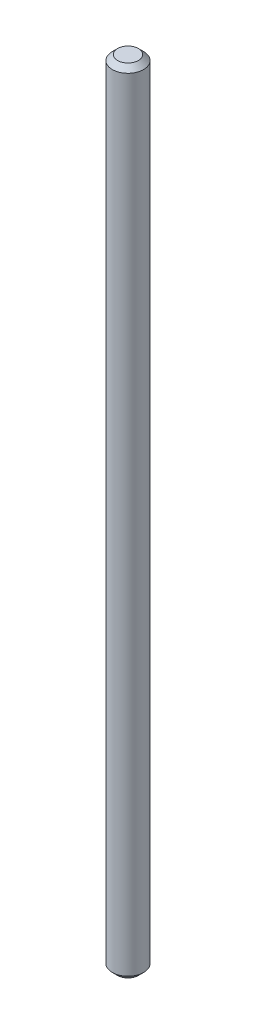
ISO-10303-21;
HEADER;
FILE_DESCRIPTION(('STEP AP214'),'2;1');
FILE_NAME('part.step','',(''),(''),'','','');
FILE_SCHEMA(('AUTOMOTIVE_DESIGN { 1 0 10303 214 1 1 1 1 }'));
ENDSEC;
DATA;
#1=APPLICATION_CONTEXT('core data for automotive mechanical design processes');
#2=APPLICATION_PROTOCOL_DEFINITION('international standard','automotive_design',2000,#1);
#3=PRODUCT_CONTEXT('',#1,'mechanical');
#4=PRODUCT('Part','Part','',(#3));
#5=PRODUCT_RELATED_PRODUCT_CATEGORY('part','',(#4));
#6=PRODUCT_DEFINITION_FORMATION('','',#4);
#7=PRODUCT_DEFINITION_CONTEXT('part definition',#1,'design');
#8=PRODUCT_DEFINITION('design','',#6,#7);
#9=PRODUCT_DEFINITION_SHAPE('','',#8);
#10=(LENGTH_UNIT() NAMED_UNIT(*) SI_UNIT(.MILLI.,.METRE.));
#11=(NAMED_UNIT(*) PLANE_ANGLE_UNIT() SI_UNIT($,.RADIAN.));
#12=(NAMED_UNIT(*) SI_UNIT($,.STERADIAN.) SOLID_ANGLE_UNIT());
#13=UNCERTAINTY_MEASURE_WITH_UNIT(LENGTH_MEASURE(1.E-05),#10,'distance_accuracy_value','');
#14=(GEOMETRIC_REPRESENTATION_CONTEXT(3) GLOBAL_UNCERTAINTY_ASSIGNED_CONTEXT((#13)) GLOBAL_UNIT_ASSIGNED_CONTEXT((#10,
#11,#12)) REPRESENTATION_CONTEXT('',''));
#15=CARTESIAN_POINT('',(0.,0.,0.));
#16=DIRECTION('',(0.,0.,1.));
#17=DIRECTION('',(1.,0.,0.));
#18=AXIS2_PLACEMENT_3D('',#15,#16,#17);
#19=CARTESIAN_POINT('',(0.,76.,0.));
#20=DIRECTION('',(0.,-1.,0.));
#21=DIRECTION('',(0.,0.,-1.));
#22=AXIS2_PLACEMENT_3D('',#19,#20,#21);
#23=CYLINDRICAL_SURFACE('',#22,1.5);
#24=CARTESIAN_POINT('',(0.,75.5,0.));
#25=DIRECTION('',(0.,1.,0.));
#26=DIRECTION('',(0.,0.,1.));
#27=AXIS2_PLACEMENT_3D('',#24,#25,#26);
#28=CIRCLE('',#27,1.5);
#29=CARTESIAN_POINT('',(0.,75.5,1.5));
#30=VERTEX_POINT('',#29);
#31=EDGE_CURVE('E39',#30,#30,#28,.F.);
#32=ORIENTED_EDGE('',*,*,#31,.T.);
#33=EDGE_LOOP('',(#32));
#34=FACE_BOUND('',#33,.T.);
#35=CARTESIAN_POINT('',(0.,0.499999999999987,0.));
#36=DIRECTION('',(0.,1.,0.));
#37=DIRECTION('',(0.,0.,1.));
#38=AXIS2_PLACEMENT_3D('',#35,#36,#37);
#39=CIRCLE('',#38,1.5);
#40=CARTESIAN_POINT('',(0.,0.499999999999987,1.5));
#41=VERTEX_POINT('',#40);
#42=EDGE_CURVE('E43',#41,#41,#39,.T.);
#43=ORIENTED_EDGE('',*,*,#42,.T.);
#44=EDGE_LOOP('',(#43));
#45=FACE_BOUND('',#44,.T.);
#46=ADVANCED_FACE('F32',(#34,#45),#23,.T.);
#47=CARTESIAN_POINT('',(0.,76.,0.));
#48=DIRECTION('',(0.,1.,0.));
#49=DIRECTION('',(0.,0.,1.));
#50=AXIS2_PLACEMENT_3D('',#47,#48,#49);
#51=PLANE('',#50);
#52=CARTESIAN_POINT('',(0.,76.,0.));
#53=DIRECTION('',(0.,1.,0.));
#54=DIRECTION('',(0.,0.,1.));
#55=AXIS2_PLACEMENT_3D('',#52,#53,#54);
#56=CIRCLE('',#55,1.);
#57=CARTESIAN_POINT('',(0.,76.,1.));
#58=VERTEX_POINT('',#57);
#59=EDGE_CURVE('E47',#58,#58,#56,.T.);
#60=ORIENTED_EDGE('',*,*,#59,.T.);
#61=EDGE_LOOP('',(#60));
#62=FACE_BOUND('',#61,.T.);
#63=ADVANCED_FACE('F53',(#62),#51,.T.);
#64=CARTESIAN_POINT('',(0.,0.,0.));
#65=DIRECTION('',(0.,1.,0.));
#66=DIRECTION('',(0.,0.,1.));
#67=AXIS2_PLACEMENT_3D('',#64,#65,#66);
#68=PLANE('',#67);
#69=CARTESIAN_POINT('',(0.,0.,0.));
#70=DIRECTION('',(0.,1.,0.));
#71=DIRECTION('',(0.,0.,1.));
#72=AXIS2_PLACEMENT_3D('',#69,#70,#71);
#73=CIRCLE('',#72,1.00000000000001);
#74=CARTESIAN_POINT('',(0.,0.,1.00000000000001));
#75=VERTEX_POINT('',#74);
#76=EDGE_CURVE('E10',#75,#75,#73,.F.);
#77=ORIENTED_EDGE('',*,*,#76,.T.);
#78=EDGE_LOOP('',(#77));
#79=FACE_BOUND('',#78,.T.);
#80=ADVANCED_FACE('F57',(#79),#68,.F.);
#81=CARTESIAN_POINT('',(0.,76.,0.));
#82=DIRECTION('',(0.,-1.,0.));
#83=DIRECTION('',(0.,0.,-1.));
#84=AXIS2_PLACEMENT_3D('',#81,#82,#83);
#85=CONICAL_SURFACE('',#84,1.,0.785398163397461);
#86=ORIENTED_EDGE('',*,*,#31,.F.);
#87=EDGE_LOOP('',(#86));
#88=FACE_BOUND('',#87,.T.);
#89=ORIENTED_EDGE('',*,*,#59,.F.);
#90=EDGE_LOOP('',(#89));
#91=FACE_BOUND('',#90,.T.);
#92=ADVANCED_FACE('F55',(#88,#91),#85,.T.);
#93=CARTESIAN_POINT('',(0.,0.499999999999987,0.));
#94=DIRECTION('',(0.,1.,0.));
#95=DIRECTION('',(0.,0.,1.));
#96=AXIS2_PLACEMENT_3D('',#93,#94,#95);
#97=CONICAL_SURFACE('',#96,1.5,0.785398163397454);
#98=ORIENTED_EDGE('',*,*,#76,.F.);
#99=EDGE_LOOP('',(#98));
#100=FACE_BOUND('',#99,.T.);
#101=ORIENTED_EDGE('',*,*,#42,.F.);
#102=EDGE_LOOP('',(#101));
#103=FACE_BOUND('',#102,.T.);
#104=ADVANCED_FACE('F34',(#100,#103),#97,.T.);
#105=CLOSED_SHELL('',(#46,#63,#80,#92,#104));
#106=MANIFOLD_SOLID_BREP('B2',#105);
#107=ADVANCED_BREP_SHAPE_REPRESENTATION('',(#18,#106),#14);
#108=SHAPE_DEFINITION_REPRESENTATION(#9,#107);
ENDSEC;
END-ISO-10303-21;
